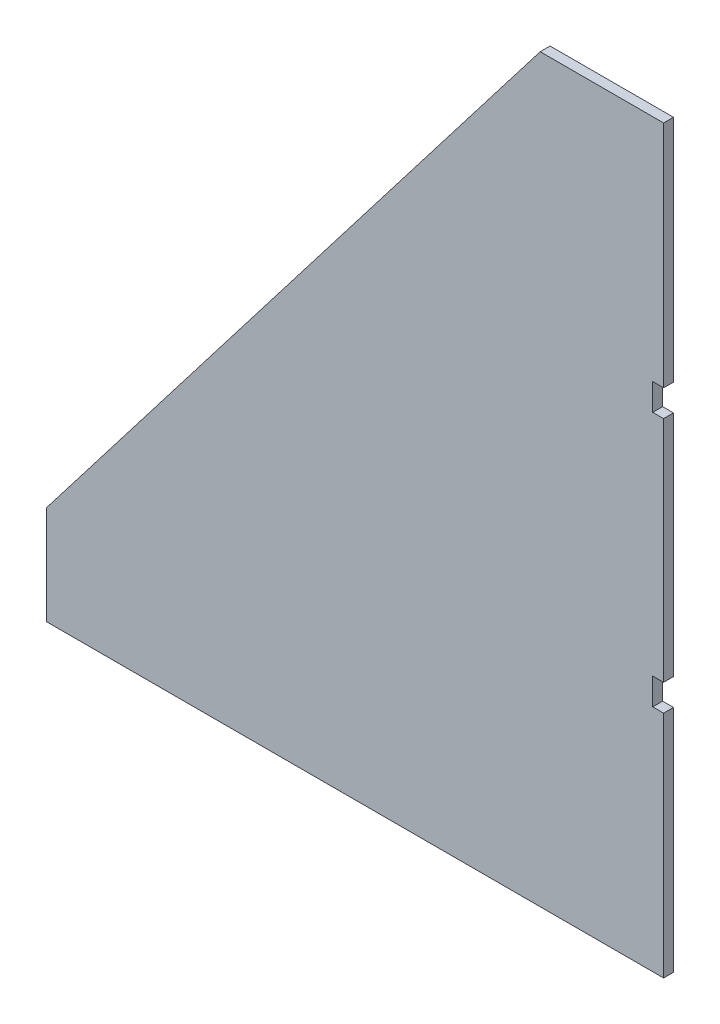
ISO-10303-21;
HEADER;
FILE_DESCRIPTION(('STEP AP214'),'2;1');
FILE_NAME('part.step','',(''),(''),'','','');
FILE_SCHEMA(('AUTOMOTIVE_DESIGN { 1 0 10303 214 1 1 1 1 }'));
ENDSEC;
DATA;
#1=APPLICATION_CONTEXT('core data for automotive mechanical design processes');
#2=APPLICATION_PROTOCOL_DEFINITION('international standard','automotive_design',2000,#1);
#3=PRODUCT_CONTEXT('',#1,'mechanical');
#4=PRODUCT('Part','Part','',(#3));
#5=PRODUCT_RELATED_PRODUCT_CATEGORY('part','',(#4));
#6=PRODUCT_DEFINITION_FORMATION('','',#4);
#7=PRODUCT_DEFINITION_CONTEXT('part definition',#1,'design');
#8=PRODUCT_DEFINITION('design','',#6,#7);
#9=PRODUCT_DEFINITION_SHAPE('','',#8);
#10=(LENGTH_UNIT() NAMED_UNIT(*) SI_UNIT(.MILLI.,.METRE.));
#11=(NAMED_UNIT(*) PLANE_ANGLE_UNIT() SI_UNIT($,.RADIAN.));
#12=(NAMED_UNIT(*) SI_UNIT($,.STERADIAN.) SOLID_ANGLE_UNIT());
#13=UNCERTAINTY_MEASURE_WITH_UNIT(LENGTH_MEASURE(1.E-05),#10,'distance_accuracy_value','');
#14=(GEOMETRIC_REPRESENTATION_CONTEXT(3) GLOBAL_UNCERTAINTY_ASSIGNED_CONTEXT((#13)) GLOBAL_UNIT_ASSIGNED_CONTEXT((#10,
#11,#12)) REPRESENTATION_CONTEXT('',''));
#15=CARTESIAN_POINT('',(0.,0.,0.));
#16=DIRECTION('',(0.,0.,1.));
#17=DIRECTION('',(1.,0.,0.));
#18=AXIS2_PLACEMENT_3D('',#15,#16,#17);
#19=CARTESIAN_POINT('',(0.,0.,170.));
#20=DIRECTION('',(0.,0.,-1.));
#21=DIRECTION('',(-1.,0.,0.));
#22=AXIS2_PLACEMENT_3D('',#19,#20,#21);
#23=PLANE('',#22);
#24=DIRECTION('',(-1.,0.,0.));
#25=VECTOR('',#24,1.);
#26=CARTESIAN_POINT('',(748.2,198.533333333333,170.));
#27=LINE('',#26,#25);
#28=CARTESIAN_POINT('',(748.,198.533333333333,170.));
#29=VERTEX_POINT('',#28);
#30=CARTESIAN_POINT('',(745.8,198.533333333333,170.));
#31=VERTEX_POINT('',#30);
#32=EDGE_CURVE('E136',#29,#31,#27,.T.);
#33=ORIENTED_EDGE('',*,*,#32,.F.);
#34=DIRECTION('',(0.,1.,0.));
#35=VECTOR('',#34,1.);
#36=CARTESIAN_POINT('',(748.,245.,170.));
#37=LINE('',#36,#35);
#38=CARTESIAN_POINT('',(748.,245.,170.));
#39=VERTEX_POINT('',#38);
#40=EDGE_CURVE('E192',#29,#39,#37,.T.);
#41=ORIENTED_EDGE('',*,*,#40,.T.);
#42=DIRECTION('',(-1.,0.,0.));
#43=VECTOR('',#42,1.);
#44=CARTESIAN_POINT('',(723.,245.,170.));
#45=LINE('',#44,#43);
#46=CARTESIAN_POINT('',(723.,245.,170.));
#47=VERTEX_POINT('',#46);
#48=EDGE_CURVE('E204',#39,#47,#45,.T.);
#49=ORIENTED_EDGE('',*,*,#48,.T.);
#50=DIRECTION('',(-0.609710760849693,-0.7926239891046,0.));
#51=VECTOR('',#50,1.);
#52=CARTESIAN_POINT('',(623.,115.,170.));
#53=LINE('',#52,#51);
#54=CARTESIAN_POINT('',(623.,115.,170.));
#55=VERTEX_POINT('',#54);
#56=EDGE_CURVE('E200',#47,#55,#53,.T.);
#57=ORIENTED_EDGE('',*,*,#56,.T.);
#58=DIRECTION('',(0.,-1.,0.));
#59=VECTOR('',#58,1.);
#60=CARTESIAN_POINT('',(623.,95.,170.));
#61=LINE('',#60,#59);
#62=CARTESIAN_POINT('',(623.,95.,170.));
#63=VERTEX_POINT('',#62);
#64=EDGE_CURVE('E197',#55,#63,#61,.T.);
#65=ORIENTED_EDGE('',*,*,#64,.T.);
#66=DIRECTION('',(1.,0.,0.));
#67=VECTOR('',#66,1.);
#68=CARTESIAN_POINT('',(748.,95.,170.));
#69=LINE('',#68,#67);
#70=CARTESIAN_POINT('',(748.,95.,170.));
#71=VERTEX_POINT('',#70);
#72=EDGE_CURVE('E185',#63,#71,#69,.T.);
#73=ORIENTED_EDGE('',*,*,#72,.T.);
#74=CARTESIAN_POINT('',(748.,141.466666666667,170.));
#75=VERTEX_POINT('',#74);
#76=EDGE_CURVE('E201',#71,#75,#37,.T.);
#77=ORIENTED_EDGE('',*,*,#76,.T.);
#78=DIRECTION('',(-1.,0.,0.));
#79=VECTOR('',#78,1.);
#80=CARTESIAN_POINT('',(748.2,141.466666666667,170.));
#81=LINE('',#80,#79);
#82=CARTESIAN_POINT('',(745.8,141.466666666667,170.));
#83=VERTEX_POINT('',#82);
#84=EDGE_CURVE('E169',#75,#83,#81,.T.);
#85=ORIENTED_EDGE('',*,*,#84,.T.);
#86=DIRECTION('',(0.,-1.,0.));
#87=VECTOR('',#86,1.);
#88=CARTESIAN_POINT('',(745.8,146.866666666667,170.));
#89=LINE('',#88,#87);
#90=CARTESIAN_POINT('',(745.8,146.866666666667,170.));
#91=VERTEX_POINT('',#90);
#92=EDGE_CURVE('E164',#91,#83,#89,.T.);
#93=ORIENTED_EDGE('',*,*,#92,.F.);
#94=DIRECTION('',(-1.,0.,0.));
#95=VECTOR('',#94,1.);
#96=CARTESIAN_POINT('',(748.2,146.866666666667,170.));
#97=LINE('',#96,#95);
#98=CARTESIAN_POINT('',(748.,146.866666666667,170.));
#99=VERTEX_POINT('',#98);
#100=EDGE_CURVE('E153',#99,#91,#97,.T.);
#101=ORIENTED_EDGE('',*,*,#100,.F.);
#102=CARTESIAN_POINT('',(748.,193.133333333333,170.));
#103=VERTEX_POINT('',#102);
#104=EDGE_CURVE('E218',#99,#103,#37,.T.);
#105=ORIENTED_EDGE('',*,*,#104,.T.);
#106=DIRECTION('',(-1.,0.,0.));
#107=VECTOR('',#106,1.);
#108=CARTESIAN_POINT('',(748.2,193.133333333333,170.));
#109=LINE('',#108,#107);
#110=CARTESIAN_POINT('',(745.8,193.133333333333,170.));
#111=VERTEX_POINT('',#110);
#112=EDGE_CURVE('E146',#103,#111,#109,.T.);
#113=ORIENTED_EDGE('',*,*,#112,.T.);
#114=DIRECTION('',(0.,-1.,0.));
#115=VECTOR('',#114,1.);
#116=CARTESIAN_POINT('',(745.8,198.533333333333,170.));
#117=LINE('',#116,#115);
#118=EDGE_CURVE('E149',#31,#111,#117,.T.);
#119=ORIENTED_EDGE('',*,*,#118,.F.);
#120=EDGE_LOOP('',(#33,#41,#49,#57,#65,#73,#77,#85,#93,#101,#105,#113,#119));
#121=FACE_BOUND('',#120,.T.);
#122=ADVANCED_FACE('F40',(#121),#23,.F.);
#123=CARTESIAN_POINT('',(748.,245.,120.));
#124=DIRECTION('',(1.,0.,0.));
#125=DIRECTION('',(0.,1.,0.));
#126=AXIS2_PLACEMENT_3D('',#123,#124,#125);
#127=PLANE('',#126);
#128=ORIENTED_EDGE('',*,*,#40,.F.);
#129=DIRECTION('',(0.,0.,-1.));
#130=VECTOR('',#129,1.);
#131=CARTESIAN_POINT('',(748.,198.533333333333,120.));
#132=LINE('',#131,#130);
#133=CARTESIAN_POINT('',(748.,198.533333333333,168.));
#134=VERTEX_POINT('',#133);
#135=EDGE_CURVE('E141',#29,#134,#132,.T.);
#136=ORIENTED_EDGE('',*,*,#135,.T.);
#137=DIRECTION('',(0.,1.,0.));
#138=VECTOR('',#137,1.);
#139=CARTESIAN_POINT('',(748.,245.,168.));
#140=LINE('',#139,#138);
#141=CARTESIAN_POINT('',(748.,245.,168.));
#142=VERTEX_POINT('',#141);
#143=EDGE_CURVE('E220',#134,#142,#140,.T.);
#144=ORIENTED_EDGE('',*,*,#143,.T.);
#145=DIRECTION('',(0.,0.,1.));
#146=VECTOR('',#145,1.);
#147=CARTESIAN_POINT('',(748.,245.,120.));
#148=LINE('',#147,#146);
#149=EDGE_CURVE('E189',#142,#39,#148,.T.);
#150=ORIENTED_EDGE('',*,*,#149,.T.);
#151=EDGE_LOOP('',(#128,#136,#144,#150));
#152=FACE_BOUND('',#151,.T.);
#153=ADVANCED_FACE('F241',(#152),#127,.T.);
#154=CARTESIAN_POINT('',(748.,146.866666666667,168.));
#155=VERTEX_POINT('',#154);
#156=CARTESIAN_POINT('',(748.,193.133333333333,168.));
#157=VERTEX_POINT('',#156);
#158=EDGE_CURVE('E225',#155,#157,#140,.T.);
#159=ORIENTED_EDGE('',*,*,#158,.T.);
#160=DIRECTION('',(0.,0.,1.));
#161=VECTOR('',#160,1.);
#162=CARTESIAN_POINT('',(748.,193.133333333333,120.));
#163=LINE('',#162,#161);
#164=EDGE_CURVE('E178',#157,#103,#163,.T.);
#165=ORIENTED_EDGE('',*,*,#164,.T.);
#166=ORIENTED_EDGE('',*,*,#104,.F.);
#167=DIRECTION('',(0.,0.,-1.));
#168=VECTOR('',#167,1.);
#169=CARTESIAN_POINT('',(748.,146.866666666667,120.));
#170=LINE('',#169,#168);
#171=EDGE_CURVE('E175',#99,#155,#170,.T.);
#172=ORIENTED_EDGE('',*,*,#171,.T.);
#173=EDGE_LOOP('',(#159,#165,#166,#172));
#174=FACE_BOUND('',#173,.T.);
#175=ADVANCED_FACE('F237',(#174),#127,.T.);
#176=CARTESIAN_POINT('',(748.,95.,168.));
#177=VERTEX_POINT('',#176);
#178=CARTESIAN_POINT('',(748.,141.466666666667,168.));
#179=VERTEX_POINT('',#178);
#180=EDGE_CURVE('E221',#177,#179,#140,.T.);
#181=ORIENTED_EDGE('',*,*,#180,.T.);
#182=DIRECTION('',(0.,0.,1.));
#183=VECTOR('',#182,1.);
#184=CARTESIAN_POINT('',(748.,141.466666666667,120.));
#185=LINE('',#184,#183);
#186=EDGE_CURVE('E145',#179,#75,#185,.T.);
#187=ORIENTED_EDGE('',*,*,#186,.T.);
#188=ORIENTED_EDGE('',*,*,#76,.F.);
#189=DIRECTION('',(0.,0.,1.));
#190=VECTOR('',#189,1.);
#191=CARTESIAN_POINT('',(748.,95.,120.));
#192=LINE('',#191,#190);
#193=EDGE_CURVE('E182',#177,#71,#192,.T.);
#194=ORIENTED_EDGE('',*,*,#193,.F.);
#195=EDGE_LOOP('',(#181,#187,#188,#194));
#196=FACE_BOUND('',#195,.T.);
#197=ADVANCED_FACE('F259',(#196),#127,.T.);
#198=CARTESIAN_POINT('',(0.,0.,168.));
#199=DIRECTION('',(0.,0.,-1.));
#200=DIRECTION('',(-1.,0.,0.));
#201=AXIS2_PLACEMENT_3D('',#198,#199,#200);
#202=PLANE('',#201);
#203=ORIENTED_EDGE('',*,*,#143,.F.);
#204=DIRECTION('',(-1.,0.,0.));
#205=VECTOR('',#204,1.);
#206=CARTESIAN_POINT('',(1.46944185214832E-13,198.533333333334,168.));
#207=LINE('',#206,#205);
#208=CARTESIAN_POINT('',(745.8,198.533333333333,168.));
#209=VERTEX_POINT('',#208);
#210=EDGE_CURVE('E11',#134,#209,#207,.T.);
#211=ORIENTED_EDGE('',*,*,#210,.T.);
#212=DIRECTION('',(0.,1.,0.));
#213=VECTOR('',#212,1.);
#214=CARTESIAN_POINT('',(745.8,198.533333333333,168.));
#215=LINE('',#214,#213);
#216=CARTESIAN_POINT('',(745.8,193.133333333333,168.));
#217=VERTEX_POINT('',#216);
#218=EDGE_CURVE('E152',#217,#209,#215,.T.);
#219=ORIENTED_EDGE('',*,*,#218,.F.);
#220=DIRECTION('',(1.,0.,0.));
#221=VECTOR('',#220,1.);
#222=CARTESIAN_POINT('',(1.42947382326182E-13,193.133333333334,168.));
#223=LINE('',#222,#221);
#224=EDGE_CURVE('E48',#217,#157,#223,.T.);
#225=ORIENTED_EDGE('',*,*,#224,.T.);
#226=ORIENTED_EDGE('',*,*,#158,.F.);
#227=DIRECTION('',(-1.,0.,0.));
#228=VECTOR('',#227,1.);
#229=CARTESIAN_POINT('',(1.08703169922188E-13,146.866666666667,168.));
#230=LINE('',#229,#228);
#231=CARTESIAN_POINT('',(745.8,146.866666666667,168.));
#232=VERTEX_POINT('',#231);
#233=EDGE_CURVE('E228',#155,#232,#230,.T.);
#234=ORIENTED_EDGE('',*,*,#233,.T.);
#235=DIRECTION('',(0.,1.,0.));
#236=VECTOR('',#235,1.);
#237=CARTESIAN_POINT('',(745.8,146.866666666667,168.));
#238=LINE('',#237,#236);
#239=CARTESIAN_POINT('',(745.8,141.466666666667,168.));
#240=VERTEX_POINT('',#239);
#241=EDGE_CURVE('E167',#240,#232,#238,.T.);
#242=ORIENTED_EDGE('',*,*,#241,.F.);
#243=DIRECTION('',(1.,0.,0.));
#244=VECTOR('',#243,1.);
#245=CARTESIAN_POINT('',(1.04706367033537E-13,141.466666666667,168.));
#246=LINE('',#245,#244);
#247=EDGE_CURVE('E224',#240,#179,#246,.T.);
#248=ORIENTED_EDGE('',*,*,#247,.T.);
#249=ORIENTED_EDGE('',*,*,#180,.F.);
#250=DIRECTION('',(1.,0.,0.));
#251=VECTOR('',#250,1.);
#252=CARTESIAN_POINT('',(748.,95.,168.));
#253=LINE('',#252,#251);
#254=CARTESIAN_POINT('',(623.,95.,168.));
#255=VERTEX_POINT('',#254);
#256=EDGE_CURVE('E211',#255,#177,#253,.T.);
#257=ORIENTED_EDGE('',*,*,#256,.F.);
#258=DIRECTION('',(0.,-1.,0.));
#259=VECTOR('',#258,1.);
#260=CARTESIAN_POINT('',(623.,95.,168.));
#261=LINE('',#260,#259);
#262=CARTESIAN_POINT('',(623.,115.,168.));
#263=VERTEX_POINT('',#262);
#264=EDGE_CURVE('E207',#263,#255,#261,.T.);
#265=ORIENTED_EDGE('',*,*,#264,.F.);
#266=DIRECTION('',(-0.609710760849693,-0.7926239891046,0.));
#267=VECTOR('',#266,1.);
#268=CARTESIAN_POINT('',(623.,115.,168.));
#269=LINE('',#268,#267);
#270=CARTESIAN_POINT('',(723.,245.,168.));
#271=VERTEX_POINT('',#270);
#272=EDGE_CURVE('E212',#271,#263,#269,.T.);
#273=ORIENTED_EDGE('',*,*,#272,.F.);
#274=DIRECTION('',(-1.,0.,0.));
#275=VECTOR('',#274,1.);
#276=CARTESIAN_POINT('',(723.,245.,168.));
#277=LINE('',#276,#275);
#278=EDGE_CURVE('E208',#142,#271,#277,.T.);
#279=ORIENTED_EDGE('',*,*,#278,.F.);
#280=EDGE_LOOP('',(#203,#211,#219,#225,#226,#234,#242,#248,#249,#257,#265,#273,#279));
#281=FACE_BOUND('',#280,.T.);
#282=ADVANCED_FACE('F42',(#281),#202,.T.);
#283=CARTESIAN_POINT('',(623.,95.,120.));
#284=DIRECTION('',(-1.,0.,0.));
#285=DIRECTION('',(0.,0.,1.));
#286=AXIS2_PLACEMENT_3D('',#283,#284,#285);
#287=PLANE('',#286);
#288=ORIENTED_EDGE('',*,*,#264,.T.);
#289=DIRECTION('',(0.,0.,1.));
#290=VECTOR('',#289,1.);
#291=CARTESIAN_POINT('',(623.,95.,120.));
#292=LINE('',#291,#290);
#293=EDGE_CURVE('E183',#255,#63,#292,.T.);
#294=ORIENTED_EDGE('',*,*,#293,.T.);
#295=ORIENTED_EDGE('',*,*,#64,.F.);
#296=DIRECTION('',(0.,0.,1.));
#297=VECTOR('',#296,1.);
#298=CARTESIAN_POINT('',(623.,115.,120.));
#299=LINE('',#298,#297);
#300=EDGE_CURVE('E193',#263,#55,#299,.T.);
#301=ORIENTED_EDGE('',*,*,#300,.F.);
#302=EDGE_LOOP('',(#288,#294,#295,#301));
#303=FACE_BOUND('',#302,.T.);
#304=ADVANCED_FACE('F270',(#303),#287,.T.);
#305=CARTESIAN_POINT('',(748.,95.,120.));
#306=DIRECTION('',(0.,-1.,0.));
#307=DIRECTION('',(1.,0.,0.));
#308=AXIS2_PLACEMENT_3D('',#305,#306,#307);
#309=PLANE('',#308);
#310=ORIENTED_EDGE('',*,*,#293,.F.);
#311=ORIENTED_EDGE('',*,*,#256,.T.);
#312=ORIENTED_EDGE('',*,*,#193,.T.);
#313=ORIENTED_EDGE('',*,*,#72,.F.);
#314=EDGE_LOOP('',(#310,#311,#312,#313));
#315=FACE_BOUND('',#314,.T.);
#316=ADVANCED_FACE('F264',(#315),#309,.T.);
#317=CARTESIAN_POINT('',(723.,245.,120.));
#318=DIRECTION('',(0.,1.,0.));
#319=DIRECTION('',(-1.,0.,0.));
#320=AXIS2_PLACEMENT_3D('',#317,#318,#319);
#321=PLANE('',#320);
#322=ORIENTED_EDGE('',*,*,#149,.F.);
#323=ORIENTED_EDGE('',*,*,#278,.T.);
#324=DIRECTION('',(0.,0.,1.));
#325=VECTOR('',#324,1.);
#326=CARTESIAN_POINT('',(723.,245.,120.));
#327=LINE('',#326,#325);
#328=EDGE_CURVE('E190',#271,#47,#327,.T.);
#329=ORIENTED_EDGE('',*,*,#328,.T.);
#330=ORIENTED_EDGE('',*,*,#48,.F.);
#331=EDGE_LOOP('',(#322,#323,#329,#330));
#332=FACE_BOUND('',#331,.T.);
#333=ADVANCED_FACE('F246',(#332),#321,.T.);
#334=CARTESIAN_POINT('',(623.,115.,120.));
#335=DIRECTION('',(-0.7926239891046,0.609710760849693,0.));
#336=DIRECTION('',(-0.609710760849693,-0.7926239891046,0.));
#337=AXIS2_PLACEMENT_3D('',#334,#335,#336);
#338=PLANE('',#337);
#339=ORIENTED_EDGE('',*,*,#328,.F.);
#340=ORIENTED_EDGE('',*,*,#272,.T.);
#341=ORIENTED_EDGE('',*,*,#300,.T.);
#342=ORIENTED_EDGE('',*,*,#56,.F.);
#343=EDGE_LOOP('',(#339,#340,#341,#342));
#344=FACE_BOUND('',#343,.T.);
#345=ADVANCED_FACE('F268',(#344),#338,.T.);
#346=CARTESIAN_POINT('',(748.2,146.866666666667,168.));
#347=DIRECTION('',(0.,-1.,0.));
#348=DIRECTION('',(1.,0.,0.));
#349=AXIS2_PLACEMENT_3D('',#346,#347,#348);
#350=PLANE('',#349);
#351=ORIENTED_EDGE('',*,*,#100,.T.);
#352=DIRECTION('',(0.,0.,1.));
#353=VECTOR('',#352,1.);
#354=CARTESIAN_POINT('',(745.8,146.866666666667,168.));
#355=LINE('',#354,#353);
#356=EDGE_CURVE('E161',#232,#91,#355,.T.);
#357=ORIENTED_EDGE('',*,*,#356,.F.);
#358=ORIENTED_EDGE('',*,*,#233,.F.);
#359=ORIENTED_EDGE('',*,*,#171,.F.);
#360=EDGE_LOOP('',(#351,#357,#358,#359));
#361=FACE_BOUND('',#360,.T.);
#362=ADVANCED_FACE('F251',(#361),#350,.T.);
#363=CARTESIAN_POINT('',(748.2,141.466666666667,168.));
#364=DIRECTION('',(0.,1.,0.));
#365=DIRECTION('',(-1.,0.,0.));
#366=AXIS2_PLACEMENT_3D('',#363,#364,#365);
#367=PLANE('',#366);
#368=ORIENTED_EDGE('',*,*,#247,.F.);
#369=DIRECTION('',(0.,0.,-1.));
#370=VECTOR('',#369,1.);
#371=CARTESIAN_POINT('',(745.8,141.466666666667,168.));
#372=LINE('',#371,#370);
#373=EDGE_CURVE('E63',#83,#240,#372,.T.);
#374=ORIENTED_EDGE('',*,*,#373,.F.);
#375=ORIENTED_EDGE('',*,*,#84,.F.);
#376=ORIENTED_EDGE('',*,*,#186,.F.);
#377=EDGE_LOOP('',(#368,#374,#375,#376));
#378=FACE_BOUND('',#377,.T.);
#379=ADVANCED_FACE('F271',(#378),#367,.T.);
#380=CARTESIAN_POINT('',(745.8,0.,0.));
#381=DIRECTION('',(1.,0.,0.));
#382=DIRECTION('',(0.,0.,-1.));
#383=AXIS2_PLACEMENT_3D('',#380,#381,#382);
#384=PLANE('',#383);
#385=ORIENTED_EDGE('',*,*,#356,.T.);
#386=ORIENTED_EDGE('',*,*,#92,.T.);
#387=ORIENTED_EDGE('',*,*,#373,.T.);
#388=ORIENTED_EDGE('',*,*,#241,.T.);
#389=EDGE_LOOP('',(#385,#386,#387,#388));
#390=FACE_BOUND('',#389,.T.);
#391=ADVANCED_FACE('F252',(#390),#384,.T.);
#392=CARTESIAN_POINT('',(748.2,198.533333333333,168.));
#393=DIRECTION('',(0.,-1.,0.));
#394=DIRECTION('',(1.,0.,0.));
#395=AXIS2_PLACEMENT_3D('',#392,#393,#394);
#396=PLANE('',#395);
#397=ORIENTED_EDGE('',*,*,#32,.T.);
#398=DIRECTION('',(0.,0.,1.));
#399=VECTOR('',#398,1.);
#400=CARTESIAN_POINT('',(745.8,198.533333333333,168.));
#401=LINE('',#400,#399);
#402=EDGE_CURVE('E139',#209,#31,#401,.T.);
#403=ORIENTED_EDGE('',*,*,#402,.F.);
#404=ORIENTED_EDGE('',*,*,#210,.F.);
#405=ORIENTED_EDGE('',*,*,#135,.F.);
#406=EDGE_LOOP('',(#397,#403,#404,#405));
#407=FACE_BOUND('',#406,.T.);
#408=ADVANCED_FACE('F138',(#407),#396,.T.);
#409=CARTESIAN_POINT('',(748.2,193.133333333333,168.));
#410=DIRECTION('',(0.,1.,0.));
#411=DIRECTION('',(-1.,0.,0.));
#412=AXIS2_PLACEMENT_3D('',#409,#410,#411);
#413=PLANE('',#412);
#414=ORIENTED_EDGE('',*,*,#224,.F.);
#415=DIRECTION('',(0.,0.,-1.));
#416=VECTOR('',#415,1.);
#417=CARTESIAN_POINT('',(745.8,193.133333333333,168.));
#418=LINE('',#417,#416);
#419=EDGE_CURVE('E55',#111,#217,#418,.T.);
#420=ORIENTED_EDGE('',*,*,#419,.F.);
#421=ORIENTED_EDGE('',*,*,#112,.F.);
#422=ORIENTED_EDGE('',*,*,#164,.F.);
#423=EDGE_LOOP('',(#414,#420,#421,#422));
#424=FACE_BOUND('',#423,.T.);
#425=ADVANCED_FACE('F359',(#424),#413,.T.);
#426=CARTESIAN_POINT('',(745.8,0.,0.));
#427=DIRECTION('',(1.,0.,0.));
#428=DIRECTION('',(0.,0.,-1.));
#429=AXIS2_PLACEMENT_3D('',#426,#427,#428);
#430=PLANE('',#429);
#431=ORIENTED_EDGE('',*,*,#402,.T.);
#432=ORIENTED_EDGE('',*,*,#118,.T.);
#433=ORIENTED_EDGE('',*,*,#419,.T.);
#434=ORIENTED_EDGE('',*,*,#218,.T.);
#435=EDGE_LOOP('',(#431,#432,#433,#434));
#436=FACE_BOUND('',#435,.T.);
#437=ADVANCED_FACE('F148',(#436),#430,.T.);
#438=CLOSED_SHELL('',(#122,#153,#175,#197,#282,#304,#316,#333,#345,#362,#379,#391,#408,#425,#437));
#439=MANIFOLD_SOLID_BREP('B2',#438);
#440=ADVANCED_BREP_SHAPE_REPRESENTATION('',(#18,#439),#14);
#441=SHAPE_DEFINITION_REPRESENTATION(#9,#440);
ENDSEC;
END-ISO-10303-21;
